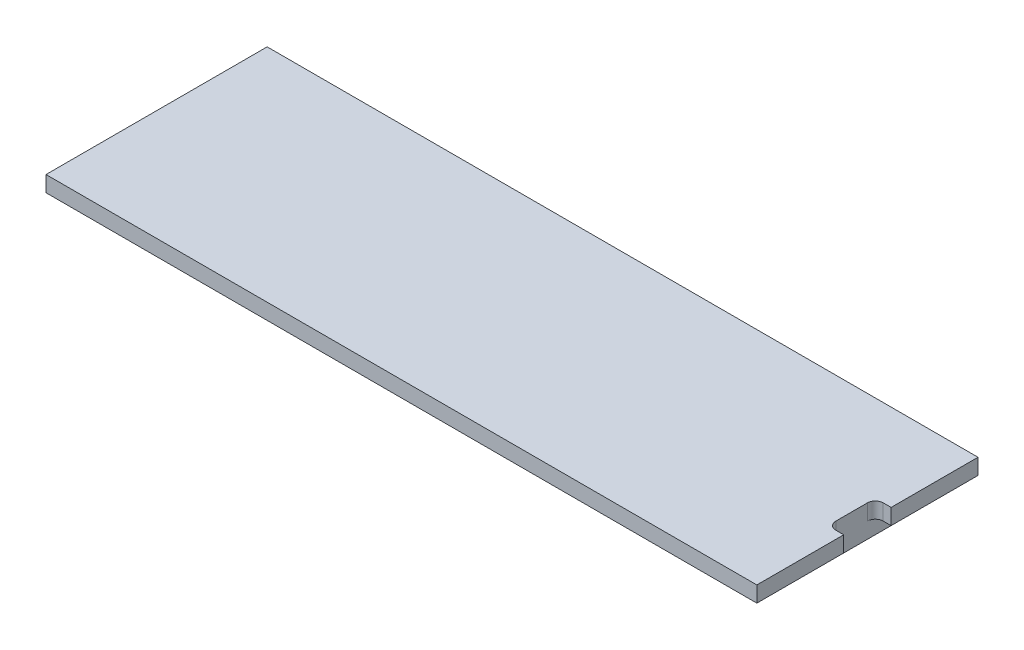
ISO-10303-21;
HEADER;
FILE_DESCRIPTION(('STEP AP214'),'2;1');
FILE_NAME('part.step','',(''),(''),'','','');
FILE_SCHEMA(('AUTOMOTIVE_DESIGN { 1 0 10303 214 1 1 1 1 }'));
ENDSEC;
DATA;
#1=APPLICATION_CONTEXT('core data for automotive mechanical design processes');
#2=APPLICATION_PROTOCOL_DEFINITION('international standard','automotive_design',2000,#1);
#3=PRODUCT_CONTEXT('',#1,'mechanical');
#4=PRODUCT('Part','Part','',(#3));
#5=PRODUCT_RELATED_PRODUCT_CATEGORY('part','',(#4));
#6=PRODUCT_DEFINITION_FORMATION('','',#4);
#7=PRODUCT_DEFINITION_CONTEXT('part definition',#1,'design');
#8=PRODUCT_DEFINITION('design','',#6,#7);
#9=PRODUCT_DEFINITION_SHAPE('','',#8);
#10=(LENGTH_UNIT() NAMED_UNIT(*) SI_UNIT(.MILLI.,.METRE.));
#11=(NAMED_UNIT(*) PLANE_ANGLE_UNIT() SI_UNIT($,.RADIAN.));
#12=(NAMED_UNIT(*) SI_UNIT($,.STERADIAN.) SOLID_ANGLE_UNIT());
#13=UNCERTAINTY_MEASURE_WITH_UNIT(LENGTH_MEASURE(1.E-05),#10,'distance_accuracy_value','');
#14=(GEOMETRIC_REPRESENTATION_CONTEXT(3) GLOBAL_UNCERTAINTY_ASSIGNED_CONTEXT((#13)) GLOBAL_UNIT_ASSIGNED_CONTEXT((#10,
#11,#12)) REPRESENTATION_CONTEXT('',''));
#15=CARTESIAN_POINT('',(0.,0.,0.));
#16=DIRECTION('',(0.,0.,1.));
#17=DIRECTION('',(1.,0.,0.));
#18=AXIS2_PLACEMENT_3D('',#15,#16,#17);
#19=CARTESIAN_POINT('',(22.5,2.,7.));
#20=DIRECTION('',(-1.,0.,0.));
#21=DIRECTION('',(0.,0.,1.));
#22=AXIS2_PLACEMENT_3D('',#19,#20,#21);
#23=PLANE('',#22);
#24=DIRECTION('',(0.,0.,-1.));
#25=VECTOR('',#24,1.);
#26=CARTESIAN_POINT('',(22.5,1.,7.));
#27=LINE('',#26,#25);
#28=CARTESIAN_POINT('',(22.5,1.,7.));
#29=VERTEX_POINT('',#28);
#30=CARTESIAN_POINT('',(22.5,1.,1.5));
#31=VERTEX_POINT('',#30);
#32=EDGE_CURVE('E193',#29,#31,#27,.T.);
#33=ORIENTED_EDGE('',*,*,#32,.T.);
#34=DIRECTION('',(0.,1.,0.));
#35=VECTOR('',#34,1.);
#36=CARTESIAN_POINT('',(22.5,1.,1.5));
#37=LINE('',#36,#35);
#38=CARTESIAN_POINT('',(22.5,2.,1.5));
#39=VERTEX_POINT('',#38);
#40=EDGE_CURVE('E186',#31,#39,#37,.T.);
#41=ORIENTED_EDGE('',*,*,#40,.T.);
#42=DIRECTION('',(0.,0.,-1.));
#43=VECTOR('',#42,1.);
#44=CARTESIAN_POINT('',(22.5,2.,7.));
#45=LINE('',#44,#43);
#46=CARTESIAN_POINT('',(22.5,2.,7.));
#47=VERTEX_POINT('',#46);
#48=EDGE_CURVE('E360',#47,#39,#45,.T.);
#49=ORIENTED_EDGE('',*,*,#48,.F.);
#50=DIRECTION('',(0.,-1.,0.));
#51=VECTOR('',#50,1.);
#52=CARTESIAN_POINT('',(22.5,2.,7.));
#53=LINE('',#52,#51);
#54=EDGE_CURVE('E212',#47,#29,#53,.T.);
#55=ORIENTED_EDGE('',*,*,#54,.T.);
#56=EDGE_LOOP('',(#33,#41,#49,#55));
#57=FACE_BOUND('',#56,.T.);
#58=ADVANCED_FACE('F40',(#57),#23,.F.);
#59=CARTESIAN_POINT('',(20.5,1.,-5.));
#60=DIRECTION('',(0.,-1.,0.));
#61=DIRECTION('',(0.,0.,-1.));
#62=AXIS2_PLACEMENT_3D('',#59,#60,#61);
#63=CYLINDRICAL_SURFACE('',#62,1.);
#64=CARTESIAN_POINT('',(20.5,0.,-5.));
#65=DIRECTION('',(0.,1.,0.));
#66=DIRECTION('',(0.,0.,1.));
#67=AXIS2_PLACEMENT_3D('',#64,#65,#66);
#68=CIRCLE('',#67,1.);
#69=CARTESIAN_POINT('',(21.5,0.,-5.));
#70=VERTEX_POINT('',#69);
#71=CARTESIAN_POINT('',(20.5,0.,-6.));
#72=VERTEX_POINT('',#71);
#73=EDGE_CURVE('E227',#70,#72,#68,.T.);
#74=ORIENTED_EDGE('',*,*,#73,.T.);
#75=DIRECTION('',(0.,-1.,0.));
#76=VECTOR('',#75,1.);
#77=CARTESIAN_POINT('',(20.5,1.,-6.));
#78=LINE('',#77,#76);
#79=CARTESIAN_POINT('',(20.5,1.,-6.));
#80=VERTEX_POINT('',#79);
#81=EDGE_CURVE('E312',#80,#72,#78,.T.);
#82=ORIENTED_EDGE('',*,*,#81,.F.);
#83=CARTESIAN_POINT('',(20.5,1.,-5.));
#84=DIRECTION('',(0.,1.,0.));
#85=DIRECTION('',(0.,0.,1.));
#86=AXIS2_PLACEMENT_3D('',#83,#84,#85);
#87=CIRCLE('',#86,1.);
#88=CARTESIAN_POINT('',(21.5,1.,-5.));
#89=VERTEX_POINT('',#88);
#90=EDGE_CURVE('E228',#89,#80,#87,.T.);
#91=ORIENTED_EDGE('',*,*,#90,.F.);
#92=DIRECTION('',(0.,-1.,0.));
#93=VECTOR('',#92,1.);
#94=CARTESIAN_POINT('',(21.5,1.,-5.));
#95=LINE('',#94,#93);
#96=EDGE_CURVE('E261',#89,#70,#95,.T.);
#97=ORIENTED_EDGE('',*,*,#96,.T.);
#98=EDGE_LOOP('',(#74,#82,#91,#97));
#99=FACE_BOUND('',#98,.T.);
#100=ADVANCED_FACE('F391',(#99),#63,.T.);
#101=CARTESIAN_POINT('',(-20.5,1.,-6.));
#102=DIRECTION('',(0.,0.,1.));
#103=DIRECTION('',(1.,0.,0.));
#104=AXIS2_PLACEMENT_3D('',#101,#102,#103);
#105=PLANE('',#104);
#106=DIRECTION('',(-1.,0.,0.));
#107=VECTOR('',#106,1.);
#108=CARTESIAN_POINT('',(-20.5,0.,-6.));
#109=LINE('',#108,#107);
#110=CARTESIAN_POINT('',(-20.5,0.,-6.));
#111=VERTEX_POINT('',#110);
#112=EDGE_CURVE('E265',#72,#111,#109,.T.);
#113=ORIENTED_EDGE('',*,*,#112,.T.);
#114=DIRECTION('',(0.,-1.,0.));
#115=VECTOR('',#114,1.);
#116=CARTESIAN_POINT('',(-20.5,1.,-6.));
#117=LINE('',#116,#115);
#118=CARTESIAN_POINT('',(-20.5,1.,-6.));
#119=VERTEX_POINT('',#118);
#120=EDGE_CURVE('E308',#119,#111,#117,.T.);
#121=ORIENTED_EDGE('',*,*,#120,.F.);
#122=DIRECTION('',(-1.,0.,0.));
#123=VECTOR('',#122,1.);
#124=CARTESIAN_POINT('',(-20.5,1.,-6.));
#125=LINE('',#124,#123);
#126=EDGE_CURVE('E232',#80,#119,#125,.T.);
#127=ORIENTED_EDGE('',*,*,#126,.F.);
#128=ORIENTED_EDGE('',*,*,#81,.T.);
#129=EDGE_LOOP('',(#113,#121,#127,#128));
#130=FACE_BOUND('',#129,.T.);
#131=ADVANCED_FACE('F401',(#130),#105,.F.);
#132=CARTESIAN_POINT('',(-20.5,1.,-5.));
#133=DIRECTION('',(0.,-1.,0.));
#134=DIRECTION('',(0.,0.,-1.));
#135=AXIS2_PLACEMENT_3D('',#132,#133,#134);
#136=CYLINDRICAL_SURFACE('',#135,1.);
#137=CARTESIAN_POINT('',(-20.5,0.,-5.));
#138=DIRECTION('',(0.,1.,0.));
#139=DIRECTION('',(0.,0.,-1.));
#140=AXIS2_PLACEMENT_3D('',#137,#138,#139);
#141=CIRCLE('',#140,1.);
#142=CARTESIAN_POINT('',(-21.5,0.,-5.));
#143=VERTEX_POINT('',#142);
#144=EDGE_CURVE('E268',#111,#143,#141,.T.);
#145=ORIENTED_EDGE('',*,*,#144,.T.);
#146=DIRECTION('',(0.,-1.,0.));
#147=VECTOR('',#146,1.);
#148=CARTESIAN_POINT('',(-21.5,1.,-5.));
#149=LINE('',#148,#147);
#150=CARTESIAN_POINT('',(-21.5,1.,-5.));
#151=VERTEX_POINT('',#150);
#152=EDGE_CURVE('E304',#151,#143,#149,.T.);
#153=ORIENTED_EDGE('',*,*,#152,.F.);
#154=CARTESIAN_POINT('',(-20.5,1.,-5.));
#155=DIRECTION('',(0.,1.,0.));
#156=DIRECTION('',(0.,0.,-1.));
#157=AXIS2_PLACEMENT_3D('',#154,#155,#156);
#158=CIRCLE('',#157,1.);
#159=EDGE_CURVE('E237',#119,#151,#158,.T.);
#160=ORIENTED_EDGE('',*,*,#159,.F.);
#161=ORIENTED_EDGE('',*,*,#120,.T.);
#162=EDGE_LOOP('',(#145,#153,#160,#161));
#163=FACE_BOUND('',#162,.T.);
#164=ADVANCED_FACE('F405',(#163),#136,.T.);
#165=CARTESIAN_POINT('',(-21.5,1.,4.99999999999999));
#166=DIRECTION('',(1.,0.,0.));
#167=DIRECTION('',(0.,0.,-1.));
#168=AXIS2_PLACEMENT_3D('',#165,#166,#167);
#169=PLANE('',#168);
#170=DIRECTION('',(0.,0.,1.));
#171=VECTOR('',#170,1.);
#172=CARTESIAN_POINT('',(-21.5,0.,4.99999999999999));
#173=LINE('',#172,#171);
#174=CARTESIAN_POINT('',(-21.5,0.,4.99999999999999));
#175=VERTEX_POINT('',#174);
#176=EDGE_CURVE('E271',#143,#175,#173,.T.);
#177=ORIENTED_EDGE('',*,*,#176,.T.);
#178=DIRECTION('',(0.,-1.,0.));
#179=VECTOR('',#178,1.);
#180=CARTESIAN_POINT('',(-21.5,1.,4.99999999999999));
#181=LINE('',#180,#179);
#182=CARTESIAN_POINT('',(-21.5,1.,4.99999999999999));
#183=VERTEX_POINT('',#182);
#184=EDGE_CURVE('E300',#183,#175,#181,.T.);
#185=ORIENTED_EDGE('',*,*,#184,.F.);
#186=DIRECTION('',(0.,0.,1.));
#187=VECTOR('',#186,1.);
#188=CARTESIAN_POINT('',(-21.5,1.,4.99999999999999));
#189=LINE('',#188,#187);
#190=EDGE_CURVE('E241',#151,#183,#189,.T.);
#191=ORIENTED_EDGE('',*,*,#190,.F.);
#192=ORIENTED_EDGE('',*,*,#152,.T.);
#193=EDGE_LOOP('',(#177,#185,#191,#192));
#194=FACE_BOUND('',#193,.T.);
#195=ADVANCED_FACE('F407',(#194),#169,.F.);
#196=CARTESIAN_POINT('',(-20.5,1.,5.));
#197=DIRECTION('',(0.,-1.,0.));
#198=DIRECTION('',(0.,0.,-1.));
#199=AXIS2_PLACEMENT_3D('',#196,#197,#198);
#200=CYLINDRICAL_SURFACE('',#199,1.);
#201=CARTESIAN_POINT('',(-20.5,0.,5.));
#202=DIRECTION('',(0.,1.,0.));
#203=DIRECTION('',(0.,0.,1.));
#204=AXIS2_PLACEMENT_3D('',#201,#202,#203);
#205=CIRCLE('',#204,1.);
#206=CARTESIAN_POINT('',(-20.5,0.,6.));
#207=VERTEX_POINT('',#206);
#208=EDGE_CURVE('E274',#175,#207,#205,.T.);
#209=ORIENTED_EDGE('',*,*,#208,.T.);
#210=DIRECTION('',(0.,-1.,0.));
#211=VECTOR('',#210,1.);
#212=CARTESIAN_POINT('',(-20.5,1.,6.));
#213=LINE('',#212,#211);
#214=CARTESIAN_POINT('',(-20.5,1.,6.));
#215=VERTEX_POINT('',#214);
#216=EDGE_CURVE('E296',#215,#207,#213,.T.);
#217=ORIENTED_EDGE('',*,*,#216,.F.);
#218=CARTESIAN_POINT('',(-20.5,1.,5.));
#219=DIRECTION('',(0.,1.,0.));
#220=DIRECTION('',(0.,0.,1.));
#221=AXIS2_PLACEMENT_3D('',#218,#219,#220);
#222=CIRCLE('',#221,1.);
#223=EDGE_CURVE('E245',#183,#215,#222,.T.);
#224=ORIENTED_EDGE('',*,*,#223,.F.);
#225=ORIENTED_EDGE('',*,*,#184,.T.);
#226=EDGE_LOOP('',(#209,#217,#224,#225));
#227=FACE_BOUND('',#226,.T.);
#228=ADVANCED_FACE('F411',(#227),#200,.T.);
#229=CARTESIAN_POINT('',(-20.5,1.,6.));
#230=DIRECTION('',(0.,0.,-1.));
#231=DIRECTION('',(-1.,0.,0.));
#232=AXIS2_PLACEMENT_3D('',#229,#230,#231);
#233=PLANE('',#232);
#234=DIRECTION('',(1.,0.,0.));
#235=VECTOR('',#234,1.);
#236=CARTESIAN_POINT('',(-20.5,0.,6.));
#237=LINE('',#236,#235);
#238=CARTESIAN_POINT('',(20.5,0.,6.));
#239=VERTEX_POINT('',#238);
#240=EDGE_CURVE('E277',#207,#239,#237,.T.);
#241=ORIENTED_EDGE('',*,*,#240,.T.);
#242=DIRECTION('',(0.,-1.,0.));
#243=VECTOR('',#242,1.);
#244=CARTESIAN_POINT('',(20.5,1.,6.));
#245=LINE('',#244,#243);
#246=CARTESIAN_POINT('',(20.5,1.,6.));
#247=VERTEX_POINT('',#246);
#248=EDGE_CURVE('E292',#247,#239,#245,.T.);
#249=ORIENTED_EDGE('',*,*,#248,.F.);
#250=DIRECTION('',(1.,0.,0.));
#251=VECTOR('',#250,1.);
#252=CARTESIAN_POINT('',(-20.5,1.,6.));
#253=LINE('',#252,#251);
#254=EDGE_CURVE('E249',#215,#247,#253,.T.);
#255=ORIENTED_EDGE('',*,*,#254,.F.);
#256=ORIENTED_EDGE('',*,*,#216,.T.);
#257=EDGE_LOOP('',(#241,#249,#255,#256));
#258=FACE_BOUND('',#257,.T.);
#259=ADVANCED_FACE('F415',(#258),#233,.F.);
#260=CARTESIAN_POINT('',(20.5,1.,5.));
#261=DIRECTION('',(0.,-1.,0.));
#262=DIRECTION('',(0.,0.,-1.));
#263=AXIS2_PLACEMENT_3D('',#260,#261,#262);
#264=CYLINDRICAL_SURFACE('',#263,1.);
#265=CARTESIAN_POINT('',(20.5,0.,5.));
#266=DIRECTION('',(0.,1.,0.));
#267=DIRECTION('',(0.,0.,-1.));
#268=AXIS2_PLACEMENT_3D('',#265,#266,#267);
#269=CIRCLE('',#268,1.);
#270=CARTESIAN_POINT('',(21.5,0.,4.99999999999999));
#271=VERTEX_POINT('',#270);
#272=EDGE_CURVE('E280',#239,#271,#269,.T.);
#273=ORIENTED_EDGE('',*,*,#272,.T.);
#274=DIRECTION('',(0.,-1.,0.));
#275=VECTOR('',#274,1.);
#276=CARTESIAN_POINT('',(21.5,1.,4.99999999999999));
#277=LINE('',#276,#275);
#278=CARTESIAN_POINT('',(21.5,1.,4.99999999999999));
#279=VERTEX_POINT('',#278);
#280=EDGE_CURVE('E288',#279,#271,#277,.T.);
#281=ORIENTED_EDGE('',*,*,#280,.F.);
#282=CARTESIAN_POINT('',(20.5,1.,5.));
#283=DIRECTION('',(0.,1.,0.));
#284=DIRECTION('',(0.,0.,-1.));
#285=AXIS2_PLACEMENT_3D('',#282,#283,#284);
#286=CIRCLE('',#285,1.);
#287=EDGE_CURVE('E253',#247,#279,#286,.T.);
#288=ORIENTED_EDGE('',*,*,#287,.F.);
#289=ORIENTED_EDGE('',*,*,#248,.T.);
#290=EDGE_LOOP('',(#273,#281,#288,#289));
#291=FACE_BOUND('',#290,.T.);
#292=ADVANCED_FACE('F417',(#291),#264,.T.);
#293=CARTESIAN_POINT('',(21.5,1.,4.99999999999999));
#294=DIRECTION('',(-1.,0.,0.));
#295=DIRECTION('',(0.,0.,1.));
#296=AXIS2_PLACEMENT_3D('',#293,#294,#295);
#297=PLANE('',#296);
#298=DIRECTION('',(0.,0.,-1.));
#299=VECTOR('',#298,1.);
#300=CARTESIAN_POINT('',(21.5,1.,4.99999999999999));
#301=LINE('',#300,#299);
#302=CARTESIAN_POINT('',(21.5,1.,-1.));
#303=VERTEX_POINT('',#302);
#304=EDGE_CURVE('E257',#303,#89,#301,.T.);
#305=ORIENTED_EDGE('',*,*,#304,.F.);
#306=DIRECTION('',(0.,1.,0.));
#307=VECTOR('',#306,1.);
#308=CARTESIAN_POINT('',(21.5,2.,-1.));
#309=LINE('',#308,#307);
#310=CARTESIAN_POINT('',(21.5,2.,-1.));
#311=VERTEX_POINT('',#310);
#312=EDGE_CURVE('E320',#303,#311,#309,.T.);
#313=ORIENTED_EDGE('',*,*,#312,.T.);
#314=DIRECTION('',(0.,0.,1.));
#315=VECTOR('',#314,1.);
#316=CARTESIAN_POINT('',(21.5,2.,1.5));
#317=LINE('',#316,#315);
#318=CARTESIAN_POINT('',(21.5,2.,1.));
#319=VERTEX_POINT('',#318);
#320=EDGE_CURVE('E341',#311,#319,#317,.T.);
#321=ORIENTED_EDGE('',*,*,#320,.T.);
#322=DIRECTION('',(0.,1.,0.));
#323=VECTOR('',#322,1.);
#324=CARTESIAN_POINT('',(21.5,1.,1.));
#325=LINE('',#324,#323);
#326=CARTESIAN_POINT('',(21.5,1.,1.));
#327=VERTEX_POINT('',#326);
#328=EDGE_CURVE('E316',#319,#327,#325,.F.);
#329=ORIENTED_EDGE('',*,*,#328,.T.);
#330=EDGE_CURVE('E258',#279,#327,#301,.T.);
#331=ORIENTED_EDGE('',*,*,#330,.F.);
#332=ORIENTED_EDGE('',*,*,#280,.T.);
#333=DIRECTION('',(0.,0.,-1.));
#334=VECTOR('',#333,1.);
#335=CARTESIAN_POINT('',(21.5,0.,4.99999999999999));
#336=LINE('',#335,#334);
#337=EDGE_CURVE('E233',#271,#70,#336,.T.);
#338=ORIENTED_EDGE('',*,*,#337,.T.);
#339=ORIENTED_EDGE('',*,*,#96,.F.);
#340=EDGE_LOOP('',(#305,#313,#321,#329,#331,#332,#338,#339));
#341=FACE_BOUND('',#340,.T.);
#342=ADVANCED_FACE('F343',(#341),#297,.F.);
#343=CARTESIAN_POINT('',(20.5,0.,-5.));
#344=DIRECTION('',(0.,1.,0.));
#345=DIRECTION('',(0.,0.,1.));
#346=AXIS2_PLACEMENT_3D('',#343,#344,#345);
#347=PLANE('',#346);
#348=ORIENTED_EDGE('',*,*,#73,.F.);
#349=ORIENTED_EDGE('',*,*,#337,.F.);
#350=ORIENTED_EDGE('',*,*,#272,.F.);
#351=ORIENTED_EDGE('',*,*,#240,.F.);
#352=ORIENTED_EDGE('',*,*,#208,.F.);
#353=ORIENTED_EDGE('',*,*,#176,.F.);
#354=ORIENTED_EDGE('',*,*,#144,.F.);
#355=ORIENTED_EDGE('',*,*,#112,.F.);
#356=EDGE_LOOP('',(#348,#349,#350,#351,#352,#353,#354,#355));
#357=FACE_BOUND('',#356,.T.);
#358=ADVANCED_FACE('F396',(#357),#347,.F.);
#359=CARTESIAN_POINT('',(22.5,2.,-1.5));
#360=VERTEX_POINT('',#359);
#361=CARTESIAN_POINT('',(22.5,2.,-7.));
#362=VERTEX_POINT('',#361);
#363=EDGE_CURVE('E184',#360,#362,#45,.T.);
#364=ORIENTED_EDGE('',*,*,#363,.F.);
#365=DIRECTION('',(0.,1.,0.));
#366=VECTOR('',#365,1.);
#367=CARTESIAN_POINT('',(22.5,1.,-1.5));
#368=LINE('',#367,#366);
#369=CARTESIAN_POINT('',(22.5,1.,-1.5));
#370=VERTEX_POINT('',#369);
#371=EDGE_CURVE('E167',#370,#360,#368,.T.);
#372=ORIENTED_EDGE('',*,*,#371,.F.);
#373=CARTESIAN_POINT('',(22.5,1.,-7.));
#374=VERTEX_POINT('',#373);
#375=EDGE_CURVE('E182',#370,#374,#27,.T.);
#376=ORIENTED_EDGE('',*,*,#375,.T.);
#377=DIRECTION('',(0.,-1.,0.));
#378=VECTOR('',#377,1.);
#379=CARTESIAN_POINT('',(22.5,2.,-7.));
#380=LINE('',#379,#378);
#381=EDGE_CURVE('E224',#362,#374,#380,.T.);
#382=ORIENTED_EDGE('',*,*,#381,.F.);
#383=EDGE_LOOP('',(#364,#372,#376,#382));
#384=FACE_BOUND('',#383,.T.);
#385=ADVANCED_FACE('F180',(#384),#23,.F.);
#386=CARTESIAN_POINT('',(-22.5,2.,-7.));
#387=DIRECTION('',(0.,0.,1.));
#388=DIRECTION('',(1.,0.,0.));
#389=AXIS2_PLACEMENT_3D('',#386,#387,#388);
#390=PLANE('',#389);
#391=DIRECTION('',(-1.,0.,0.));
#392=VECTOR('',#391,1.);
#393=CARTESIAN_POINT('',(-22.5,1.,-7.));
#394=LINE('',#393,#392);
#395=CARTESIAN_POINT('',(-22.5,1.,-7.));
#396=VERTEX_POINT('',#395);
#397=EDGE_CURVE('E190',#374,#396,#394,.T.);
#398=ORIENTED_EDGE('',*,*,#397,.T.);
#399=DIRECTION('',(0.,-1.,0.));
#400=VECTOR('',#399,1.);
#401=CARTESIAN_POINT('',(-22.5,2.,-7.));
#402=LINE('',#401,#400);
#403=CARTESIAN_POINT('',(-22.5,2.,-7.));
#404=VERTEX_POINT('',#403);
#405=EDGE_CURVE('E220',#404,#396,#402,.T.);
#406=ORIENTED_EDGE('',*,*,#405,.F.);
#407=DIRECTION('',(-1.,0.,0.));
#408=VECTOR('',#407,1.);
#409=CARTESIAN_POINT('',(-22.5,2.,-7.));
#410=LINE('',#409,#408);
#411=EDGE_CURVE('E363',#362,#404,#410,.T.);
#412=ORIENTED_EDGE('',*,*,#411,.F.);
#413=ORIENTED_EDGE('',*,*,#381,.T.);
#414=EDGE_LOOP('',(#398,#406,#412,#413));
#415=FACE_BOUND('',#414,.T.);
#416=ADVANCED_FACE('F382',(#415),#390,.F.);
#417=CARTESIAN_POINT('',(-22.5,2.,7.));
#418=DIRECTION('',(1.,0.,0.));
#419=DIRECTION('',(0.,0.,-1.));
#420=AXIS2_PLACEMENT_3D('',#417,#418,#419);
#421=PLANE('',#420);
#422=DIRECTION('',(0.,0.,1.));
#423=VECTOR('',#422,1.);
#424=CARTESIAN_POINT('',(-22.5,1.,7.));
#425=LINE('',#424,#423);
#426=CARTESIAN_POINT('',(-22.5,1.,7.));
#427=VERTEX_POINT('',#426);
#428=EDGE_CURVE('E206',#396,#427,#425,.T.);
#429=ORIENTED_EDGE('',*,*,#428,.T.);
#430=DIRECTION('',(0.,-1.,0.));
#431=VECTOR('',#430,1.);
#432=CARTESIAN_POINT('',(-22.5,2.,7.));
#433=LINE('',#432,#431);
#434=CARTESIAN_POINT('',(-22.5,2.,7.));
#435=VERTEX_POINT('',#434);
#436=EDGE_CURVE('E216',#435,#427,#433,.T.);
#437=ORIENTED_EDGE('',*,*,#436,.F.);
#438=DIRECTION('',(0.,0.,1.));
#439=VECTOR('',#438,1.);
#440=CARTESIAN_POINT('',(-22.5,2.,7.));
#441=LINE('',#440,#439);
#442=EDGE_CURVE('E365',#404,#435,#441,.T.);
#443=ORIENTED_EDGE('',*,*,#442,.F.);
#444=ORIENTED_EDGE('',*,*,#405,.T.);
#445=EDGE_LOOP('',(#429,#437,#443,#444));
#446=FACE_BOUND('',#445,.T.);
#447=ADVANCED_FACE('F378',(#446),#421,.F.);
#448=CARTESIAN_POINT('',(-22.5,2.,7.));
#449=DIRECTION('',(0.,0.,-1.));
#450=DIRECTION('',(-1.,0.,0.));
#451=AXIS2_PLACEMENT_3D('',#448,#449,#450);
#452=PLANE('',#451);
#453=DIRECTION('',(1.,0.,0.));
#454=VECTOR('',#453,1.);
#455=CARTESIAN_POINT('',(-22.5,1.,7.));
#456=LINE('',#455,#454);
#457=EDGE_CURVE('E209',#427,#29,#456,.T.);
#458=ORIENTED_EDGE('',*,*,#457,.T.);
#459=ORIENTED_EDGE('',*,*,#54,.F.);
#460=DIRECTION('',(1.,0.,0.));
#461=VECTOR('',#460,1.);
#462=CARTESIAN_POINT('',(-22.5,2.,7.));
#463=LINE('',#462,#461);
#464=EDGE_CURVE('E202',#435,#47,#463,.T.);
#465=ORIENTED_EDGE('',*,*,#464,.F.);
#466=ORIENTED_EDGE('',*,*,#436,.T.);
#467=EDGE_LOOP('',(#458,#459,#465,#466));
#468=FACE_BOUND('',#467,.T.);
#469=ADVANCED_FACE('F374',(#468),#452,.F.);
#470=CARTESIAN_POINT('',(0.,2.,0.));
#471=DIRECTION('',(0.,-1.,0.));
#472=DIRECTION('',(0.,0.,-1.));
#473=AXIS2_PLACEMENT_3D('',#470,#471,#472);
#474=PLANE('',#473);
#475=ORIENTED_EDGE('',*,*,#48,.T.);
#476=DIRECTION('',(1.,0.,0.));
#477=VECTOR('',#476,1.);
#478=CARTESIAN_POINT('',(21.5,2.,1.5));
#479=LINE('',#478,#477);
#480=CARTESIAN_POINT('',(22.,2.,1.5));
#481=VERTEX_POINT('',#480);
#482=EDGE_CURVE('E176',#481,#39,#479,.T.);
#483=ORIENTED_EDGE('',*,*,#482,.F.);
#484=CARTESIAN_POINT('',(22.,2.,1.));
#485=DIRECTION('',(0.,-1.,0.));
#486=DIRECTION('',(0.,0.,-1.));
#487=AXIS2_PLACEMENT_3D('',#484,#485,#486);
#488=CIRCLE('',#487,0.5);
#489=EDGE_CURVE('E49',#481,#319,#488,.T.);
#490=ORIENTED_EDGE('',*,*,#489,.T.);
#491=ORIENTED_EDGE('',*,*,#320,.F.);
#492=CARTESIAN_POINT('',(22.,2.,-1.));
#493=DIRECTION('',(0.,-1.,0.));
#494=DIRECTION('',(0.,0.,-1.));
#495=AXIS2_PLACEMENT_3D('',#492,#493,#494);
#496=CIRCLE('',#495,0.5);
#497=CARTESIAN_POINT('',(22.,2.,-1.5));
#498=VERTEX_POINT('',#497);
#499=EDGE_CURVE('E329',#311,#498,#496,.T.);
#500=ORIENTED_EDGE('',*,*,#499,.T.);
#501=DIRECTION('',(-1.,0.,0.));
#502=VECTOR('',#501,1.);
#503=CARTESIAN_POINT('',(21.5,2.,-1.5));
#504=LINE('',#503,#502);
#505=EDGE_CURVE('E347',#360,#498,#504,.T.);
#506=ORIENTED_EDGE('',*,*,#505,.F.);
#507=ORIENTED_EDGE('',*,*,#363,.T.);
#508=ORIENTED_EDGE('',*,*,#411,.T.);
#509=ORIENTED_EDGE('',*,*,#442,.T.);
#510=ORIENTED_EDGE('',*,*,#464,.T.);
#511=EDGE_LOOP('',(#475,#483,#490,#491,#500,#506,#507,#508,#509,#510));
#512=FACE_BOUND('',#511,.T.);
#513=ADVANCED_FACE('F340',(#512),#474,.F.);
#514=CARTESIAN_POINT('',(0.,1.,0.));
#515=DIRECTION('',(0.,-1.,0.));
#516=DIRECTION('',(0.,0.,-1.));
#517=AXIS2_PLACEMENT_3D('',#514,#515,#516);
#518=PLANE('',#517);
#519=ORIENTED_EDGE('',*,*,#330,.T.);
#520=CARTESIAN_POINT('',(22.,1.,1.));
#521=DIRECTION('',(0.,-1.,0.));
#522=DIRECTION('',(0.,0.,-1.));
#523=AXIS2_PLACEMENT_3D('',#520,#521,#522);
#524=CIRCLE('',#523,0.5);
#525=CARTESIAN_POINT('',(22.,1.,1.5));
#526=VERTEX_POINT('',#525);
#527=EDGE_CURVE('E11',#327,#526,#524,.F.);
#528=ORIENTED_EDGE('',*,*,#527,.T.);
#529=DIRECTION('',(1.,0.,0.));
#530=VECTOR('',#529,1.);
#531=CARTESIAN_POINT('',(21.5,1.,1.5));
#532=LINE('',#531,#530);
#533=EDGE_CURVE('E175',#526,#31,#532,.T.);
#534=ORIENTED_EDGE('',*,*,#533,.T.);
#535=ORIENTED_EDGE('',*,*,#32,.F.);
#536=ORIENTED_EDGE('',*,*,#457,.F.);
#537=ORIENTED_EDGE('',*,*,#428,.F.);
#538=ORIENTED_EDGE('',*,*,#397,.F.);
#539=ORIENTED_EDGE('',*,*,#375,.F.);
#540=DIRECTION('',(-1.,0.,0.));
#541=VECTOR('',#540,1.);
#542=CARTESIAN_POINT('',(21.5,1.,-1.5));
#543=LINE('',#542,#541);
#544=CARTESIAN_POINT('',(22.,1.,-1.5));
#545=VERTEX_POINT('',#544);
#546=EDGE_CURVE('E163',#370,#545,#543,.T.);
#547=ORIENTED_EDGE('',*,*,#546,.T.);
#548=CARTESIAN_POINT('',(22.,1.,-1.));
#549=DIRECTION('',(0.,-1.,0.));
#550=DIRECTION('',(0.,0.,-1.));
#551=AXIS2_PLACEMENT_3D('',#548,#549,#550);
#552=CIRCLE('',#551,0.5);
#553=EDGE_CURVE('E332',#545,#303,#552,.F.);
#554=ORIENTED_EDGE('',*,*,#553,.T.);
#555=ORIENTED_EDGE('',*,*,#304,.T.);
#556=ORIENTED_EDGE('',*,*,#90,.T.);
#557=ORIENTED_EDGE('',*,*,#126,.T.);
#558=ORIENTED_EDGE('',*,*,#159,.T.);
#559=ORIENTED_EDGE('',*,*,#190,.T.);
#560=ORIENTED_EDGE('',*,*,#223,.T.);
#561=ORIENTED_EDGE('',*,*,#254,.T.);
#562=ORIENTED_EDGE('',*,*,#287,.T.);
#563=EDGE_LOOP('',(#519,#528,#534,#535,#536,#537,#538,#539,#547,#554,#555,#556,#557,#558,#559,
#560,#561,#562));
#564=FACE_BOUND('',#563,.T.);
#565=ADVANCED_FACE('F188',(#564),#518,.T.);
#566=CARTESIAN_POINT('',(21.5,1.,1.5));
#567=DIRECTION('',(0.,0.,1.));
#568=DIRECTION('',(1.,0.,0.));
#569=AXIS2_PLACEMENT_3D('',#566,#567,#568);
#570=PLANE('',#569);
#571=ORIENTED_EDGE('',*,*,#533,.F.);
#572=DIRECTION('',(0.,1.,0.));
#573=VECTOR('',#572,1.);
#574=CARTESIAN_POINT('',(22.,2.,1.5));
#575=LINE('',#574,#573);
#576=EDGE_CURVE('E326',#526,#481,#575,.T.);
#577=ORIENTED_EDGE('',*,*,#576,.T.);
#578=ORIENTED_EDGE('',*,*,#482,.T.);
#579=ORIENTED_EDGE('',*,*,#40,.F.);
#580=EDGE_LOOP('',(#571,#577,#578,#579));
#581=FACE_BOUND('',#580,.T.);
#582=ADVANCED_FACE('F350',(#581),#570,.F.);
#583=CARTESIAN_POINT('',(21.5,1.,-1.5));
#584=DIRECTION('',(0.,0.,-1.));
#585=DIRECTION('',(-1.,0.,0.));
#586=AXIS2_PLACEMENT_3D('',#583,#584,#585);
#587=PLANE('',#586);
#588=ORIENTED_EDGE('',*,*,#505,.T.);
#589=DIRECTION('',(0.,1.,0.));
#590=VECTOR('',#589,1.);
#591=CARTESIAN_POINT('',(22.,1.,-1.5));
#592=LINE('',#591,#590);
#593=EDGE_CURVE('E170',#498,#545,#592,.F.);
#594=ORIENTED_EDGE('',*,*,#593,.T.);
#595=ORIENTED_EDGE('',*,*,#546,.F.);
#596=ORIENTED_EDGE('',*,*,#371,.T.);
#597=EDGE_LOOP('',(#588,#594,#595,#596));
#598=FACE_BOUND('',#597,.T.);
#599=ADVANCED_FACE('F166',(#598),#587,.F.);
#600=CARTESIAN_POINT('',(22.,1.,-1.));
#601=DIRECTION('',(0.,-1.,0.));
#602=DIRECTION('',(0.,0.,-1.));
#603=AXIS2_PLACEMENT_3D('',#600,#601,#602);
#604=CYLINDRICAL_SURFACE('',#603,0.5);
#605=ORIENTED_EDGE('',*,*,#553,.F.);
#606=ORIENTED_EDGE('',*,*,#593,.F.);
#607=ORIENTED_EDGE('',*,*,#499,.F.);
#608=ORIENTED_EDGE('',*,*,#312,.F.);
#609=EDGE_LOOP('',(#605,#606,#607,#608));
#610=FACE_BOUND('',#609,.T.);
#611=ADVANCED_FACE('F385',(#610),#604,.F.);
#612=CARTESIAN_POINT('',(22.,1.,1.));
#613=DIRECTION('',(0.,-1.,0.));
#614=DIRECTION('',(0.,0.,-1.));
#615=AXIS2_PLACEMENT_3D('',#612,#613,#614);
#616=CYLINDRICAL_SURFACE('',#615,0.5);
#617=ORIENTED_EDGE('',*,*,#527,.F.);
#618=ORIENTED_EDGE('',*,*,#328,.F.);
#619=ORIENTED_EDGE('',*,*,#489,.F.);
#620=ORIENTED_EDGE('',*,*,#576,.F.);
#621=EDGE_LOOP('',(#617,#618,#619,#620));
#622=FACE_BOUND('',#621,.T.);
#623=ADVANCED_FACE('F42',(#622),#616,.F.);
#624=CLOSED_SHELL('',(#58,#100,#131,#164,#195,#228,#259,#292,#342,#358,#385,#416,#447,#469,#513,
#565,#582,#599,#611,#623));
#625=MANIFOLD_SOLID_BREP('B2',#624);
#626=ADVANCED_BREP_SHAPE_REPRESENTATION('',(#18,#625),#14);
#627=SHAPE_DEFINITION_REPRESENTATION(#9,#626);
ENDSEC;
END-ISO-10303-21;
